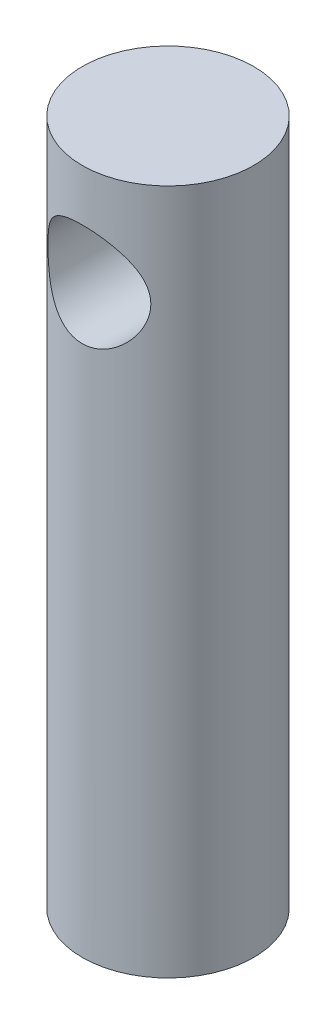
ISO-10303-21;
HEADER;
FILE_DESCRIPTION(('STEP AP214'),'2;1');
FILE_NAME('part.step','',(''),(''),'','','');
FILE_SCHEMA(('AUTOMOTIVE_DESIGN { 1 0 10303 214 1 1 1 1 }'));
ENDSEC;
DATA;
#1=APPLICATION_CONTEXT('core data for automotive mechanical design processes');
#2=APPLICATION_PROTOCOL_DEFINITION('international standard','automotive_design',2000,#1);
#3=PRODUCT_CONTEXT('',#1,'mechanical');
#4=PRODUCT('Part','Part','',(#3));
#5=PRODUCT_RELATED_PRODUCT_CATEGORY('part','',(#4));
#6=PRODUCT_DEFINITION_FORMATION('','',#4);
#7=PRODUCT_DEFINITION_CONTEXT('part definition',#1,'design');
#8=PRODUCT_DEFINITION('design','',#6,#7);
#9=PRODUCT_DEFINITION_SHAPE('','',#8);
#10=(LENGTH_UNIT() NAMED_UNIT(*) SI_UNIT(.MILLI.,.METRE.));
#11=(NAMED_UNIT(*) PLANE_ANGLE_UNIT() SI_UNIT($,.RADIAN.));
#12=(NAMED_UNIT(*) SI_UNIT($,.STERADIAN.) SOLID_ANGLE_UNIT());
#13=UNCERTAINTY_MEASURE_WITH_UNIT(LENGTH_MEASURE(1.E-05),#10,'distance_accuracy_value','');
#14=(GEOMETRIC_REPRESENTATION_CONTEXT(3) GLOBAL_UNCERTAINTY_ASSIGNED_CONTEXT((#13)) GLOBAL_UNIT_ASSIGNED_CONTEXT((#10,
#11,#12)) REPRESENTATION_CONTEXT('',''));
#15=CARTESIAN_POINT('',(0.,0.,0.));
#16=DIRECTION('',(0.,0.,1.));
#17=DIRECTION('',(1.,0.,0.));
#18=AXIS2_PLACEMENT_3D('',#15,#16,#17);
#19=CARTESIAN_POINT('',(0.,1000.,0.));
#20=DIRECTION('',(0.,-1.,0.));
#21=DIRECTION('',(0.,0.,-1.));
#22=AXIS2_PLACEMENT_3D('',#19,#20,#21);
#23=CYLINDRICAL_SURFACE('',#22,125.);
#24=CARTESIAN_POINT('',(0.,925.,-125.));
#25=CARTESIAN_POINT('',(-0.959722110232176,925.000001056757,-125.000000827529));
#26=CARTESIAN_POINT('',(-1.91941689168537,924.981574025456,-124.988941860156));
#27=CARTESIAN_POINT('',(-3.83698681383583,924.907931332241,-124.944776986206));
#28=CARTESIAN_POINT('',(-4.79486178004971,924.852712305218,-124.911669062963));
#29=CARTESIAN_POINT('',(-6.70724652643253,924.705642542479,-124.823593775022));
#30=CARTESIAN_POINT('',(-7.66175445802889,924.613774128865,-124.768615861332));
#31=CARTESIAN_POINT('',(-9.56518301751301,924.393717713739,-124.637143144398));
#32=CARTESIAN_POINT('',(-10.51410305079,924.265525915863,-124.560646092073));
#33=CARTESIAN_POINT('',(-12.4064101752449,923.972964623559,-124.386436793743));
#34=CARTESIAN_POINT('',(-13.3497817580004,923.808520831264,-124.288680983915));
#35=CARTESIAN_POINT('',(-15.2273706858531,923.444140802451,-124.07264120256));
#36=CARTESIAN_POINT('',(-16.1615870662034,923.244200867008,-123.954355091671));
#37=CARTESIAN_POINT('',(-18.0188947929254,922.809538078408,-123.698011462603));
#38=CARTESIAN_POINT('',(-18.9419888597735,922.574823925642,-123.559958890215));
#39=CARTESIAN_POINT('',(-20.7758408980345,922.071275224481,-123.264865629827));
#40=CARTESIAN_POINT('',(-21.6865976297387,921.802437274916,-123.10782304914));
#41=CARTESIAN_POINT('',(-23.4896684763035,921.232890546116,-122.77650952154));
#42=CARTESIAN_POINT('',(-24.3820528676786,920.932350952867,-122.602330334806));
#43=CARTESIAN_POINT('',(-26.1518501064884,920.299106769064,-122.237055079967));
#44=CARTESIAN_POINT('',(-27.0292615349032,919.966399149576,-122.045957418965));
#45=CARTESIAN_POINT('',(-29.6370751198179,918.921329849856,-121.448844647966));
#46=CARTESIAN_POINT('',(-31.3434666567524,918.161891798473,-121.018933691311));
#47=CARTESIAN_POINT('',(-34.682279623118,916.525155936155,-120.104687771239));
#48=CARTESIAN_POINT('',(-36.3147295642066,915.647904080245,-119.620374040424));
#49=CARTESIAN_POINT('',(-39.5000534724203,913.782071864688,-118.606657744607));
#50=CARTESIAN_POINT('',(-41.0529243797474,912.793487228984,-118.077253447963));
#51=CARTESIAN_POINT('',(-44.1891006504898,910.631862169676,-116.941495261235));
#52=CARTESIAN_POINT('',(-45.7656575951609,909.450498110865,-116.33235271735));
#53=CARTESIAN_POINT('',(-48.8146053883046,906.97361388502,-115.086259010443));
#54=CARTESIAN_POINT('',(-50.2869916971066,905.678088748458,-114.449306637445));
#55=CARTESIAN_POINT('',(-53.1243930618664,902.977723372946,-113.160195592913));
#56=CARTESIAN_POINT('',(-54.4892764852104,901.57275318291,-112.508019508819));
#57=CARTESIAN_POINT('',(-57.1050189315914,898.660540839028,-111.203207814469));
#58=CARTESIAN_POINT('',(-58.3558717567607,897.153293133883,-110.550572181176));
#59=CARTESIAN_POINT('',(-60.884960331711,893.850452511324,-109.18028929148));
#60=CARTESIAN_POINT('',(-62.1477056974845,892.042177034338,-108.464496962183));
#61=CARTESIAN_POINT('',(-64.5153510133502,888.309985756422,-107.073133314531));
#62=CARTESIAN_POINT('',(-65.6202248937295,886.386050930727,-106.397568649788));
#63=CARTESIAN_POINT('',(-67.6613662985516,882.432678107109,-105.111337664651));
#64=CARTESIAN_POINT('',(-68.5978539939264,880.403382415763,-104.500587032422));
#65=CARTESIAN_POINT('',(-69.8687682606836,877.28761644343,-103.651410338981));
#66=CARTESIAN_POINT('',(-70.2700981488528,876.237074667661,-103.379513444118));
#67=CARTESIAN_POINT('',(-71.026831025358,874.113474544449,-102.861068900778));
#68=CARTESIAN_POINT('',(-71.3822374634532,873.040417895365,-102.614519348499));
#69=CARTESIAN_POINT('',(-72.2170512864385,870.31377618622,-102.029778612642));
#70=CARTESIAN_POINT('',(-72.6656832954437,868.646630110673,-101.710033334953));
#71=CARTESIAN_POINT('',(-73.4487549476299,865.273436766861,-101.146001667322));
#72=CARTESIAN_POINT('',(-73.7832121999005,863.567395540702,-100.901703641758));
#73=CARTESIAN_POINT('',(-74.3333653266989,860.128162410531,-100.497103357787));
#74=CARTESIAN_POINT('',(-74.5491872203529,858.39500133554,-100.336711979238));
#75=CARTESIAN_POINT('',(-74.8594097061313,854.911807615275,-100.105477103977));
#76=CARTESIAN_POINT('',(-74.9538082082077,853.16177468011,-100.034635148671));
#77=CARTESIAN_POINT('',(-75.0197492036109,849.654621722351,-99.9851940624515));
#78=CARTESIAN_POINT('',(-74.9910494651801,847.897494530152,-100.006776804003));
#79=CARTESIAN_POINT('',(-74.810705731885,844.393151419052,-100.14175339264));
#80=CARTESIAN_POINT('',(-74.6590611396618,842.64593554835,-100.255147685815));
#81=CARTESIAN_POINT('',(-74.2350431123835,839.173148063241,-100.569516433027));
#82=CARTESIAN_POINT('',(-73.9625919652913,837.447591117435,-100.770547260196));
#83=CARTESIAN_POINT('',(-73.3007950239016,834.030577726416,-101.252953483703));
#84=CARTESIAN_POINT('',(-72.9114465285106,832.339122070131,-101.534330736563));
#85=CARTESIAN_POINT('',(-72.0265011658725,829.021625665303,-102.163954440672));
#86=CARTESIAN_POINT('',(-71.5323606557813,827.395018671879,-102.511278092645));
#87=CARTESIAN_POINT('',(-70.4399167495613,824.191424876146,-103.264989849925));
#88=CARTESIAN_POINT('',(-69.8416153032448,822.614437145656,-103.671376849589));
#89=CARTESIAN_POINT('',(-68.5456233925858,819.515258151688,-104.532782969627));
#90=CARTESIAN_POINT('',(-67.8479111769991,817.993078971965,-104.987812727663));
#91=CARTESIAN_POINT('',(-66.357759444552,815.008130194964,-105.935960169142));
#92=CARTESIAN_POINT('',(-65.5653123758729,813.545365346387,-106.429080887907));
#93=CARTESIAN_POINT('',(-63.7432483627895,810.432399496282,-107.531955984589));
#94=CARTESIAN_POINT('',(-62.6963902497333,808.794152817482,-108.147026586829));
#95=CARTESIAN_POINT('',(-60.4834207350213,805.609502833923,-109.400058352924));
#96=CARTESIAN_POINT('',(-59.3172989875114,804.063107515489,-110.038021499535));
#97=CARTESIAN_POINT('',(-56.8698999216281,801.065744010409,-111.322622724841));
#98=CARTESIAN_POINT('',(-55.5885237560561,799.614859620798,-111.969267837384));
#99=CARTESIAN_POINT('',(-52.9158697876858,796.814890878558,-113.25683318482));
#100=CARTESIAN_POINT('',(-51.524585822703,795.465812242161,-113.897753096473));
#101=CARTESIAN_POINT('',(-49.2582222607461,793.43278863153,-114.888792748737));
#102=CARTESIAN_POINT('',(-48.4184594405298,792.71230720348,-115.245436595954));
#103=CARTESIAN_POINT('',(-46.7057252580928,791.307567406611,-115.950128857788));
#104=CARTESIAN_POINT('',(-45.8327566363671,790.623306059626,-116.29817797784));
#105=CARTESIAN_POINT('',(-44.054361456332,789.292115408903,-116.983424385226));
#106=CARTESIAN_POINT('',(-43.1489277463485,788.645194413735,-117.320619250064));
#107=CARTESIAN_POINT('',(-41.306940214312,787.390268854825,-117.981752958626));
#108=CARTESIAN_POINT('',(-40.3703901010975,786.782259678191,-118.305693371982));
#109=CARTESIAN_POINT('',(-38.4674746199543,785.606647205666,-118.938044345757));
#110=CARTESIAN_POINT('',(-37.5011161447649,785.039034667575,-119.246458453626));
#111=CARTESIAN_POINT('',(-35.5398271220438,783.945620403982,-119.845617129645));
#112=CARTESIAN_POINT('',(-34.5448998412799,783.419813923777,-120.136363706277));
#113=CARTESIAN_POINT('',(-32.5279228529798,782.4114995065,-120.698094907616));
#114=CARTESIAN_POINT('',(-31.5058740766011,781.928990085402,-120.96908020959));
#115=CARTESIAN_POINT('',(-29.4363535735109,781.008816407253,-121.489256188738));
#116=CARTESIAN_POINT('',(-28.3888823204157,780.571151315552,-121.738447271537));
#117=CARTESIAN_POINT('',(-26.3371591990944,779.768312010638,-122.198153186774));
#118=CARTESIAN_POINT('',(-25.3343381336027,779.400308706496,-122.410115272246));
#119=CARTESIAN_POINT('',(-23.3098855693829,778.706282354478,-122.811701661605));
#120=CARTESIAN_POINT('',(-22.2882546226098,778.380258077012,-123.001326619745));
#121=CARTESIAN_POINT('',(-20.2281279051509,777.771359183524,-123.356862236975));
#122=CARTESIAN_POINT('',(-19.1896320520454,777.488484778448,-123.522772780133));
#123=CARTESIAN_POINT('',(-17.0979338882479,776.966977164884,-123.829632823954));
#124=CARTESIAN_POINT('',(-16.044731574276,776.728343966263,-123.97058231905));
#125=CARTESIAN_POINT('',(-13.9269985702488,776.296503734738,-124.226306044393));
#126=CARTESIAN_POINT('',(-12.8624801114943,776.103252017558,-124.341106019049));
#127=CARTESIAN_POINT('',(-10.7235594023813,775.762691330875,-124.543804612451));
#128=CARTESIAN_POINT('',(-9.64915707448271,775.615382722117,-124.631703019966));
#129=CARTESIAN_POINT('',(-7.49321782783113,775.367373367225,-124.779882482276));
#130=CARTESIAN_POINT('',(-6.41168175756668,775.266667176079,-124.840166763488));
#131=CARTESIAN_POINT('',(-4.24408130202927,775.112295821684,-124.932639429713));
#132=CARTESIAN_POINT('',(-3.15801708293274,775.058628947166,-124.964828836806));
#133=CARTESIAN_POINT('',(-1.13201067501296,775.002658579889,-124.998403395086));
#134=CARTESIAN_POINT('',(-0.192286881873205,774.994361514585,-125.003383014656));
#135=CARTESIAN_POINT('',(1.68677156880062,775.013083618454,-124.992149976467));
#136=CARTESIAN_POINT('',(2.62610618702842,775.040105753486,-124.975935538978));
#137=CARTESIAN_POINT('',(4.50230163962597,775.129370647731,-124.922415399725));
#138=CARTESIAN_POINT('',(5.43916293922211,775.191606226445,-124.885113997881));
#139=CARTESIAN_POINT('',(7.30892565842403,775.351088040059,-124.789646915423));
#140=CARTESIAN_POINT('',(8.24182667398913,775.448337764298,-124.731479155372));
#141=CARTESIAN_POINT('',(10.1017151523698,775.677505735627,-124.594641566255));
#142=CARTESIAN_POINT('',(11.0287034075919,775.80941923278,-124.515974546192));
#143=CARTESIAN_POINT('',(12.8753120491395,776.10750258115,-124.338597533696));
#144=CARTESIAN_POINT('',(13.7949316835551,776.273675883206,-124.239885522234));
#145=CARTESIAN_POINT('',(15.6250520127251,776.639735471408,-124.023008522261));
#146=CARTESIAN_POINT('',(16.5355534493232,776.83961899094,-123.904845130151));
#147=CARTESIAN_POINT('',(18.3460218791383,777.272493565739,-123.6497462284));
#148=CARTESIAN_POINT('',(19.2459878807409,777.505487710748,-123.512808966903));
#149=CARTESIAN_POINT('',(21.8840183505763,778.240918316345,-123.082125217543));
#150=CARTESIAN_POINT('',(23.6055344969327,778.78894390347,-122.763057811301));
#151=CARTESIAN_POINT('',(26.9931120805186,780.002780969192,-122.062955848234));
#152=CARTESIAN_POINT('',(28.6591752053481,780.668588859423,-121.681923179275));
#153=CARTESIAN_POINT('',(31.9283951093063,782.112074590156,-120.865281140487));
#154=CARTESIAN_POINT('',(33.531546471849,782.889762036502,-120.42966708478));
#155=CARTESIAN_POINT('',(36.668220061423,784.55084456278,-119.511977443166));
#156=CARTESIAN_POINT('',(38.2017379532471,785.434246211802,-119.029898970318));
#157=CARTESIAN_POINT('',(41.3490243395466,787.397716694428,-117.975803321683));
#158=CARTESIAN_POINT('',(42.9546132286456,788.488680686134,-117.399644074125));
#159=CARTESIAN_POINT('',(46.0684603278338,790.784800376854,-116.213053300481));
#160=CARTESIAN_POINT('',(47.5767128815785,791.98996270206,-115.602619786519));
#161=CARTESIAN_POINT('',(50.4924328227858,794.509188556576,-114.359208923005));
#162=CARTESIAN_POINT('',(51.8997913678158,795.823366489673,-113.726208298408));
#163=CARTESIAN_POINT('',(54.6074506452903,798.553684305109,-112.4511720888));
#164=CARTESIAN_POINT('',(55.9077460902192,799.969829216814,-111.80913605939));
#165=CARTESIAN_POINT('',(58.5592120487927,803.090094776814,-110.446007061375));
#166=CARTESIAN_POINT('',(59.8948967590172,804.807684429514,-109.725525258644));
#167=CARTESIAN_POINT('',(62.4167971064168,808.360008541963,-108.310823876526));
#168=CARTESIAN_POINT('',(63.6029886862773,810.19476178497,-107.616608536639));
#169=CARTESIAN_POINT('',(65.8165687985047,813.972671702881,-106.277239297247));
#170=CARTESIAN_POINT('',(66.844087746857,815.915737546391,-105.632045330148));
#171=CARTESIAN_POINT('',(68.7316108138498,819.90303496788,-104.413735297036));
#172=CARTESIAN_POINT('',(69.5916658315065,821.947235569304,-103.840597349129));
#173=CARTESIAN_POINT('',(70.9669282315919,825.674214395668,-102.903984433554));
#174=CARTESIAN_POINT('',(71.516497341583,827.339712348054,-102.521960644653));
#175=CARTESIAN_POINT('',(72.5005409134891,830.71874866518,-101.828455778032));
#176=CARTESIAN_POINT('',(72.9350308151248,832.432280551251,-101.516965237962));
#177=CARTESIAN_POINT('',(73.6832110560725,835.896105095789,-100.975234980827));
#178=CARTESIAN_POINT('',(73.9970439121234,837.646351793585,-100.744899432801));
#179=CARTESIAN_POINT('',(74.5001921887106,841.174156465221,-100.373401254296));
#180=CARTESIAN_POINT('',(74.689506882237,842.951714598459,-100.232239144463));
#181=CARTESIAN_POINT('',(74.9410941269177,846.527672967696,-100.044277813329));
#182=CARTESIAN_POINT('',(75.0028795156397,848.326126830675,-99.9978404488127));
#183=CARTESIAN_POINT('',(74.9969141079794,851.922696142193,-100.002314333306));
#184=CARTESIAN_POINT('',(74.9291630839338,853.720811590133,-100.053225753409));
#185=CARTESIAN_POINT('',(74.6651986421464,857.303114238546,-100.25036118264));
#186=CARTESIAN_POINT('',(74.4689241300454,859.087294406439,-100.396630520541));
#187=CARTESIAN_POINT('',(73.9509838188765,862.627468416299,-100.77874303513));
#188=CARTESIAN_POINT('',(73.6293175020419,864.383462141845,-101.014586581686));
#189=CARTESIAN_POINT('',(72.8836135105945,867.771917404358,-101.553825664236));
#190=CARTESIAN_POINT('',(72.4652798518774,869.406245866085,-101.853402104021));
#191=CARTESIAN_POINT('',(71.7593299386909,871.824395916468,-102.350774281899));
#192=CARTESIAN_POINT('',(71.5109302682659,872.624910977927,-102.524571850917));
#193=CARTESIAN_POINT('',(70.9885088237164,874.214280501626,-102.886990283486));
#194=CARTESIAN_POINT('',(70.7144832695028,875.003133223609,-103.075613333295));
#195=CARTESIAN_POINT('',(69.854861479861,877.350982842934,-103.661852491916));
#196=CARTESIAN_POINT('',(69.2317028311689,878.891330225605,-104.079850908929));
#197=CARTESIAN_POINT('',(67.8899829322411,881.916919984408,-104.95996179042));
#198=CARTESIAN_POINT('',(67.1714094993927,883.402155292763,-105.422079886003));
#199=CARTESIAN_POINT('',(65.9666208591409,885.697399987175,-106.1775665863));
#200=CARTESIAN_POINT('',(65.5107240607951,886.52722825365,-106.45961077841));
#201=CARTESIAN_POINT('',(64.5694770852888,888.166421207447,-107.033108698817));
#202=CARTESIAN_POINT('',(64.0841328191744,888.975789955742,-107.32456053324));
#203=CARTESIAN_POINT('',(62.5847037544419,891.372787540599,-108.210453157144));
#204=CARTESIAN_POINT('',(61.5272208862301,892.929311146389,-108.816432209348));
#205=CARTESIAN_POINT('',(59.301259957115,895.95532318331,-110.045346588003));
#206=CARTESIAN_POINT('',(58.132703493946,897.424748929875,-110.668293666861));
#207=CARTESIAN_POINT('',(55.6895229411553,900.271211935068,-111.917646521187));
#208=CARTESIAN_POINT('',(54.414892110051,901.648243311575,-112.544052514119));
#209=CARTESIAN_POINT('',(51.5469955162066,904.522245131933,-113.889459947338));
#210=CARTESIAN_POINT('',(49.9357029244182,906.002027149487,-114.606859810657));
#211=CARTESIAN_POINT('',(46.5814368661932,908.821497122548,-116.010662780973));
#212=CARTESIAN_POINT('',(44.8384474398094,910.161168051356,-116.697062114951));
#213=CARTESIAN_POINT('',(42.1312467559261,912.057826871904,-117.689779442055));
#214=CARTESIAN_POINT('',(41.2130091078271,912.671460701862,-118.014660453567));
#215=CARTESIAN_POINT('',(39.3467658315937,913.859652712167,-118.649917930763));
#216=CARTESIAN_POINT('',(38.3987635769574,914.434215297618,-118.960296030347));
#217=CARTESIAN_POINT('',(36.4742002441529,915.542856867671,-119.564418179021));
#218=CARTESIAN_POINT('',(35.4976386976757,916.076935187904,-119.858161955115));
#219=CARTESIAN_POINT('',(33.5174921118791,917.103062256835,-120.426901499487));
#220=CARTESIAN_POINT('',(32.5139105562843,917.595116389959,-120.701899668666));
#221=CARTESIAN_POINT('',(30.5121065162629,918.52145985692,-121.223134564924));
#222=CARTESIAN_POINT('',(29.5146475946872,918.957050007605,-121.469991282912));
#223=CARTESIAN_POINT('',(27.497499491762,919.785932101836,-121.94244694616));
#224=CARTESIAN_POINT('',(26.4778130520264,920.179229226833,-122.168048495036));
#225=CARTESIAN_POINT('',(24.4176771791565,920.922326661825,-122.596428245745));
#226=CARTESIAN_POINT('',(23.377222470256,921.272115751991,-122.799200559112));
#227=CARTESIAN_POINT('',(21.2778708682989,921.926776139414,-123.180316146907));
#228=CARTESIAN_POINT('',(20.2189742462824,922.231648096194,-123.358659780021));
#229=CARTESIAN_POINT('',(18.0884896644123,922.794343443069,-123.688983846501));
#230=CARTESIAN_POINT('',(17.0169548440774,923.052318147469,-123.841048986229));
#231=CARTESIAN_POINT('',(14.8602391369951,923.521364701453,-124.118311603157));
#232=CARTESIAN_POINT('',(13.775058566974,923.732437637541,-124.243509702744));
#233=CARTESIAN_POINT('',(11.5944171933402,924.106629256784,-124.465938650613));
#234=CARTESIAN_POINT('',(10.4989641369105,924.269781482356,-124.563189060031));
#235=CARTESIAN_POINT('',(8.29993864770838,924.547560431281,-124.729011488361));
#236=CARTESIAN_POINT('',(7.19636801166442,924.662197582473,-124.79758967005));
#237=CARTESIAN_POINT('',(5.5841318357061,924.79355186047,-124.876236241724));
#238=CARTESIAN_POINT('',(5.07752302863693,924.829651950288,-124.897863073969));
#239=CARTESIAN_POINT('',(4.06356774322271,924.891557166917,-124.934961950125));
#240=CARTESIAN_POINT('',(3.55622146186317,924.917364665179,-124.950435411794));
#241=CARTESIAN_POINT('',(2.03318452317516,924.979321606339,-124.987589252958));
#242=CARTESIAN_POINT('',(1.01657693026111,924.999998880639,-124.999999123447));
#243=CARTESIAN_POINT('',(0.,925.,-125.));
#244=B_SPLINE_CURVE_WITH_KNOTS('',3,(#24,#25,#26,#27,#28,#29,#30,#31,#32,#33,#34,#35,#36,#37,
#38,#39,#40,#41,#42,#43,#44,#45,#46,#47,#48,#49,#50,#51,#52,#53,#54,#55,#56,#57,#58,#59,#60,#61,
#62,#63,#64,#65,#66,#67,#68,#69,#70,#71,#72,#73,#74,#75,#76,#77,#78,#79,#80,#81,#82,#83,#84,#85,
#86,#87,#88,#89,#90,#91,#92,#93,#94,#95,#96,#97,#98,#99,#100,#101,#102,#103,#104,#105,#106,#107,
#108,#109,#110,#111,#112,#113,#114,#115,#116,#117,#118,#119,#120,#121,#122,#123,#124,#125,#126,
#127,#128,#129,#130,#131,#132,#133,#134,#135,#136,#137,#138,#139,#140,#141,#142,#143,#144,#145,
#146,#147,#148,#149,#150,#151,#152,#153,#154,#155,#156,#157,#158,#159,#160,#161,#162,#163,#164,
#165,#166,#167,#168,#169,#170,#171,#172,#173,#174,#175,#176,#177,#178,#179,#180,#181,#182,#183,
#184,#185,#186,#187,#188,#189,#190,#191,#192,#193,#194,#195,#196,#197,#198,#199,#200,#201,#202,
#203,#204,#205,#206,#207,#208,#209,#210,#211,#212,#213,#214,#215,#216,#217,#218,#219,#220,#221,
#222,#223,#224,#225,#226,#227,#228,#229,#230,#231,#232,#233,#234,#235,#236,#237,#238,#239,#240,
#241,#242,#243),.UNSPECIFIED.,.T.,.F.,(4,2,2,2,2,2,2,2,2,2,2,2,2,2,2,2,2,2,2,2,2,2,2,2,2,2,2,2,
2,2,2,2,2,2,2,2,2,2,2,2,2,2,2,2,2,2,2,2,2,2,2,2,2,2,2,2,2,2,2,2,2,2,2,2,2,2,2,2,2,2,2,2,2,2,2,2,
2,2,2,2,2,2,2,2,2,2,2,2,2,2,2,2,2,2,2,2,2,2,2,2,2,2,2,2,2,2,2,2,2,4),(0.,2.8788789130324,
5.75802117342907,8.63855387569456,11.519387749958,14.406181663071,17.2932765754072,
20.1796503623808,23.0663120647531,25.9382807940423,28.8105202111019,34.5536924032782,
40.2946308573531,46.0357898840059,52.2158388766049,58.3961570249827,64.5839287145585,
70.7720365257766,77.7198304689992,84.6687703961368,91.6085571958027,95.0783401752883,
98.5478623537401,103.809525294735,109.070376366275,114.325628303189,119.58097069699,
124.846659252032,130.112373391913,135.381479768101,140.650707904497,145.851013802852,
151.051222365967,156.252570495792,161.454333529548,167.565739141416,173.677675354473,
179.794904342992,185.912476549049,189.39916676629,192.885569846565,196.372745716385,
199.859507422066,203.34546882257,206.831033187575,210.31647803775,213.801858004469,
217.067807905987,220.333662124092,223.599532307399,226.865403219105,230.128044823083,
233.390712044727,236.652997961058,239.915165191937,242.73360890108,245.552289298585,
248.370395135802,251.188781889347,254.006782643728,256.825067381719,259.643120934226,
262.461437628316,267.958843338945,273.456081593953,278.953792117169,284.451844446232,
290.520290196986,296.589088276288,302.664337693498,308.739886968749,315.607887671176,
322.476992205236,329.34042049492,336.201759445526,341.581400656012,346.960319735359,
352.332865721693,357.705443075818,363.098505996434,368.491578395496,373.887216284562,
379.282876453483,384.417559675746,386.985046407484,389.552912469891,394.688456872746,
399.824657616407,402.787803600728,405.750356742433,411.675450938191,417.604758918358,
423.534444019781,430.433404939177,437.333203268209,440.785857028453,444.238120870196,
447.690441353186,451.14231883568,454.489320742556,457.835912129543,461.183364752331,
464.530768219172,467.867171771921,471.203498027092,474.537483402977,477.870751807001,
479.39569437252,480.920285382216,483.969711728449),.UNSPECIFIED.);
#245=CARTESIAN_POINT('',(0.,925.,-125.));
#246=VERTEX_POINT('',#245);
#247=EDGE_CURVE('E10',#246,#246,#244,.T.);
#248=ORIENTED_EDGE('',*,*,#247,.T.);
#249=EDGE_LOOP('',(#248));
#250=FACE_BOUND('',#249,.T.);
#251=CARTESIAN_POINT('',(75.,850.,100.));
#252=CARTESIAN_POINT('',(75.0000007368017,849.056622436247,99.9999989096946));
#253=CARTESIAN_POINT('',(74.9821944502504,848.113261800126,100.013361451452));
#254=CARTESIAN_POINT('',(74.9110489948005,846.228507952947,100.066661463235));
#255=CARTESIAN_POINT('',(74.8577053230991,845.287115006372,100.10660230089));
#256=CARTESIAN_POINT('',(74.7157283808434,843.408552637684,100.212612778481));
#257=CARTESIAN_POINT('',(74.6270978318469,842.471382895486,100.278680403343));
#258=CARTESIAN_POINT('',(74.4149526257966,840.603275294315,100.436209914724));
#259=CARTESIAN_POINT('',(74.2914423630851,839.672336665426,100.52766860231));
#260=CARTESIAN_POINT('',(74.0099155040827,837.81750439182,100.735112991167));
#261=CARTESIAN_POINT('',(73.851865019668,836.893618594613,100.851122776468));
#262=CARTESIAN_POINT('',(73.5019691426969,835.055578250258,101.106416220375));
#263=CARTESIAN_POINT('',(73.3101254303426,834.141423221692,101.245698721843));
#264=CARTESIAN_POINT('',(72.8933513195573,832.324364602375,101.546173370666));
#265=CARTESIAN_POINT('',(72.6684222246621,831.421460569864,101.707364654815));
#266=CARTESIAN_POINT('',(72.1862152766579,829.62813513841,102.050172615162));
#267=CARTESIAN_POINT('',(71.9289313146195,828.73771613215,102.231793147925));
#268=CARTESIAN_POINT('',(71.1138978818921,826.100608100762,102.802002716895));
#269=CARTESIAN_POINT('',(70.5097189620692,824.373989790534,103.218311829976));
#270=CARTESIAN_POINT('',(69.183325736937,820.983048511816,104.111988085));
#271=CARTESIAN_POINT('',(68.4610958929297,819.318733779656,104.589363263092));
#272=CARTESIAN_POINT('',(67.2938062264138,816.873577185898,105.341150303364));
#273=CARTESIAN_POINT('',(66.8906369933416,816.066933963571,105.59775050106));
#274=CARTESIAN_POINT('',(66.057070272541,814.471514565021,106.121183779168));
#275=CARTESIAN_POINT('',(65.6266798869076,813.682733800759,106.388014183388));
#276=CARTESIAN_POINT('',(64.2953702223403,811.343498631653,107.20161803512));
#277=CARTESIAN_POINT('',(63.3543353068856,809.820199166124,107.761489252337));
#278=CARTESIAN_POINT('',(61.2489405154287,806.668894183979,108.973471527398));
#279=CARTESIAN_POINT('',(60.0713433089816,805.05086677085,109.628489491473));
#280=CARTESIAN_POINT('',(57.5933476279836,801.916770544493,110.950341103677));
#281=CARTESIAN_POINT('',(56.2929420845364,800.400707608992,111.617175430163));
#282=CARTESIAN_POINT('',(53.573630679719,797.47517089369,112.947595161094));
#283=CARTESIAN_POINT('',(52.1546415212918,796.065773386196,113.611177929221));
#284=CARTESIAN_POINT('',(49.203656371982,793.360742233223,114.919991603721));
#285=CARTESIAN_POINT('',(47.6716546222543,792.065114392546,115.565221572555));
#286=CARTESIAN_POINT('',(45.2075474292111,790.14585563384,116.542577049883));
#287=CARTESIAN_POINT('',(44.3124168898355,789.480102092111,116.886072805105));
#288=CARTESIAN_POINT('',(42.4902536331552,788.187169702674,117.560715166395));
#289=CARTESIAN_POINT('',(41.5632239276132,787.559987228775,117.891862932182));
#290=CARTESIAN_POINT('',(39.6781739471354,786.345463834905,118.539597054535));
#291=CARTESIAN_POINT('',(38.7201468661564,785.758131753705,118.856180175701));
#292=CARTESIAN_POINT('',(36.7746904552977,784.625011557659,119.47243652368));
#293=CARTESIAN_POINT('',(35.7872648655137,784.079218189388,119.772111887584));
#294=CARTESIAN_POINT('',(33.7849115396492,783.03093166902,120.352256452236));
#295=CARTESIAN_POINT('',(32.7699992898733,782.528414775165,120.632736166278));
#296=CARTESIAN_POINT('',(30.7139289996957,781.567976556946,121.172538484533));
#297=CARTESIAN_POINT('',(29.6727742195617,781.110049726931,121.431863700103));
#298=CARTESIAN_POINT('',(27.5660409055945,780.240326966324,121.927372909342));
#299=CARTESIAN_POINT('',(26.5004639190105,779.828528123008,122.163558364037));
#300=CARTESIAN_POINT('',(24.3469461253674,779.052582667273,122.61091108036));
#301=CARTESIAN_POINT('',(23.2590059689748,778.688434670695,122.822079068676));
#302=CARTESIAN_POINT('',(21.1679017020807,778.041673560448,123.198776114242));
#303=CARTESIAN_POINT('',(20.1665542059339,777.754595920195,123.366737370705));
#304=CARTESIAN_POINT('',(18.1494043863423,777.22165665491,123.679588886459));
#305=CARTESIAN_POINT('',(17.1336025114624,776.975793753868,123.824479859999));
#306=CARTESIAN_POINT('',(15.0896195821245,776.526206403429,124.090150522953));
#307=CARTESIAN_POINT('',(14.0614388896689,776.322480724936,124.210930915642));
#308=CARTESIAN_POINT('',(11.994873036665,775.957958590646,124.427498553331));
#309=CARTESIAN_POINT('',(10.9564878471025,775.797162256947,124.523285727247));
#310=CARTESIAN_POINT('',(8.87266454162926,775.519265293953,124.689082979093));
#311=CARTESIAN_POINT('',(7.82723255177974,775.40213071478,124.75911308427));
#312=CARTESIAN_POINT('',(5.73093838320815,775.211872615861,124.872968189147));
#313=CARTESIAN_POINT('',(4.68007617131964,775.138749365246,124.9167930286));
#314=CARTESIAN_POINT('',(2.57552546239928,775.03683258169,124.97789728102));
#315=CARTESIAN_POINT('',(1.52183721582213,775.008035242505,124.995178973232));
#316=CARTESIAN_POINT('',(-0.585896938185308,774.994884733246,125.003069052233));
#317=CARTESIAN_POINT('',(-1.6399428338143,775.01053021688,124.993678247005));
#318=CARTESIAN_POINT('',(-3.6149908457345,775.08148873943,124.951121161703));
#319=CARTESIAN_POINT('',(-4.53625101589787,775.13163147792,124.921054002615));
#320=CARTESIAN_POINT('',(-6.37550207869955,775.265782834526,124.840699763649));
#321=CARTESIAN_POINT('',(-7.2934926924394,775.349794275054,124.790410998625));
#322=CARTESIAN_POINT('',(-9.12427582641631,775.551389911784,124.669920270467));
#323=CARTESIAN_POINT('',(-10.0370693418573,775.66896744359,124.599722260241));
#324=CARTESIAN_POINT('',(-11.8561256343953,775.937339921782,124.439808765941));
#325=CARTESIAN_POINT('',(-12.7623877759925,776.088138056633,124.350091408439));
#326=CARTESIAN_POINT('',(-14.5666888545188,776.422467168974,124.151662249955));
#327=CARTESIAN_POINT('',(-15.4647283468744,776.605995918158,124.042951742041));
#328=CARTESIAN_POINT('',(-17.2512604387961,777.005261079551,123.807132134872));
#329=CARTESIAN_POINT('',(-18.1397521306258,777.221000525584,123.680021302584));
#330=CARTESIAN_POINT('',(-19.9056811482895,777.684047781953,123.408110760951));
#331=CARTESIAN_POINT('',(-20.7831191655372,777.931353606913,123.263312164109));
#332=CARTESIAN_POINT('',(-22.5257279587952,778.456864979362,122.956800257369));
#333=CARTESIAN_POINT('',(-23.3908975995503,778.735073365651,122.795085393573));
#334=CARTESIAN_POINT('',(-25.9757748736177,779.618284608203,122.283905559516));
#335=CARTESIAN_POINT('',(-27.6752068589994,780.269338934913,121.909902685916));
#336=CARTESIAN_POINT('',(-31.0105427240236,781.687251965444,121.104464782032));
#337=CARTESIAN_POINT('',(-32.6464472001925,782.454109581535,120.673030291204));
#338=CARTESIAN_POINT('',(-35.8482001535299,784.097461113872,119.760917569423));
#339=CARTESIAN_POINT('',(-37.4140388862841,784.973970215984,119.280232519328));
#340=CARTESIAN_POINT('',(-40.4696266298914,786.830340910105,118.278464744869));
#341=CARTESIAN_POINT('',(-41.9593708619461,787.810208981328,117.7573794885));
#342=CARTESIAN_POINT('',(-45.0312196918019,789.990436661503,116.61981888469));
#343=CARTESIAN_POINT('',(-46.6030987599184,791.203152834872,115.999384397656));
#344=CARTESIAN_POINT('',(-49.6399437226057,793.743482269464,114.7326610009));
#345=CARTESIAN_POINT('',(-51.1049022386933,795.071103446376,114.086370311622));
#346=CARTESIAN_POINT('',(-53.9247181500307,797.836511915778,112.780945193724));
#347=CARTESIAN_POINT('',(-55.2794325890902,799.274437695493,112.121795420709));
#348=CARTESIAN_POINT('',(-57.8718552526224,802.253301947711,110.805964312831));
#349=CARTESIAN_POINT('',(-59.1095580719558,803.794245173308,110.149283093341));
#350=CARTESIAN_POINT('',(-61.5993651487917,807.158527613715,108.778513398027));
#351=CARTESIAN_POINT('',(-62.836472383623,808.993886232195,108.066606529788));
#352=CARTESIAN_POINT('',(-65.1505149253369,812.779960346861,106.687511195764));
#353=CARTESIAN_POINT('',(-66.2274238944586,814.730694738145,106.020330093104));
#354=CARTESIAN_POINT('',(-67.7140212276913,817.734570228739,105.072149658735));
#355=CARTESIAN_POINT('',(-68.1878522504091,818.74820668269,104.765019580684));
#356=CARTESIAN_POINT('',(-69.0916432504824,820.800655072341,104.17119105562));
#357=CARTESIAN_POINT('',(-69.5216089197493,821.839463720026,103.884489959227));
#358=CARTESIAN_POINT('',(-70.3361577619508,823.940566721267,103.334729949219));
#359=CARTESIAN_POINT('',(-70.7207523284379,825.002855098714,103.071665104061));
#360=CARTESIAN_POINT('',(-71.4431667256051,827.149259690332,102.572250729162));
#361=CARTESIAN_POINT('',(-71.7809902568666,828.233374169812,102.335899086112));
#362=CARTESIAN_POINT('',(-72.5666436310995,830.973378664995,101.781221162294));
#363=CARTESIAN_POINT('',(-72.9840649006616,832.641972582169,101.481643317991));
#364=CARTESIAN_POINT('',(-73.7048127453447,836.015194505286,100.959392973826));
#365=CARTESIAN_POINT('',(-74.0081575384667,837.719816711551,100.736708194615));
#366=CARTESIAN_POINT('',(-74.4965570122907,841.153192010726,100.376070502652));
#367=CARTESIAN_POINT('',(-74.6817288799713,842.881919455211,100.23803365354));
#368=CARTESIAN_POINT('',(-74.931479977011,846.35296394009,100.051476145472));
#369=CARTESIAN_POINT('',(-74.9960566488777,848.095281267901,100.002957384949));
#370=CARTESIAN_POINT('',(-75.0035977828384,851.582731210844,99.9973017909596));
#371=CARTESIAN_POINT('',(-74.9463948329077,853.32786440174,100.040290754337));
#372=CARTESIAN_POINT('',(-74.7109423547353,856.805319989601,100.216248282125));
#373=CARTESIAN_POINT('',(-74.5326921960041,858.537642319792,100.349217315208));
#374=CARTESIAN_POINT('',(-74.0576711774189,861.978300612968,100.700288806991));
#375=CARTESIAN_POINT('',(-73.7608206981006,863.686619662801,100.918448454126));
#376=CARTESIAN_POINT('',(-73.0526366944044,867.067383791924,101.432258806092));
#377=CARTESIAN_POINT('',(-72.641299953927,868.739827862008,101.727911687816));
#378=CARTESIAN_POINT('',(-71.7096464698695,872.037669254454,102.386772420387));
#379=CARTESIAN_POINT('',(-71.1894828321233,873.663129059483,102.749885283929));
#380=CARTESIAN_POINT('',(-70.0449324933487,876.862507281529,103.533511836864));
#381=CARTESIAN_POINT('',(-69.4205469605847,878.436426276051,103.954024882825));
#382=CARTESIAN_POINT('',(-68.0723408962971,881.527777954595,104.841822270952));
#383=CARTESIAN_POINT('',(-67.3484976360883,883.045197626014,105.309117297378));
#384=CARTESIAN_POINT('',(-65.8060243309963,886.019071571523,106.279807932011));
#385=CARTESIAN_POINT('',(-64.9873867510209,887.475520986612,106.783206408829));
#386=CARTESIAN_POINT('',(-63.1035222571498,890.580928325235,107.909019381785));
#387=CARTESIAN_POINT('',(-62.0204491844885,892.217238513035,108.53652594547));
#388=CARTESIAN_POINT('',(-59.7337309503752,895.395087216687,109.811635530006));
#389=CARTESIAN_POINT('',(-58.5300748773446,896.93661713545,110.459240365886));
#390=CARTESIAN_POINT('',(-56.0062749922354,899.921137132458,111.760075987326));
#391=CARTESIAN_POINT('',(-54.6860300731831,901.364039718048,112.413311203765));
#392=CARTESIAN_POINT('',(-51.9344286520984,904.144622396148,113.710720648592));
#393=CARTESIAN_POINT('',(-50.5030664018737,905.482297037912,114.354894406186));
#394=CARTESIAN_POINT('',(-48.1799402529957,907.488453914288,115.345246785679));
#395=CARTESIAN_POINT('',(-47.3241010495898,908.195053186404,115.699233711128));
#396=CARTESIAN_POINT('',(-45.5794840854555,909.571342143912,116.397564778456));
#397=CARTESIAN_POINT('',(-44.690709153379,910.241034986744,116.741909743986));
#398=CARTESIAN_POINT('',(-42.8810093581866,911.54235516571,117.418706323325));
#399=CARTESIAN_POINT('',(-41.9600773853749,912.173973998708,117.751155273688));
#400=CARTESIAN_POINT('',(-40.0874665931438,913.397521680541,118.401762402805));
#401=CARTESIAN_POINT('',(-39.1357915101054,913.989455325845,118.719922307036));
#402=CARTESIAN_POINT('',(-37.2031765310072,915.132045434379,119.339654182854));
#403=CARTESIAN_POINT('',(-36.2222466823979,915.682715846206,119.641231750663));
#404=CARTESIAN_POINT('',(-34.2323499687747,916.741412660446,120.225710137427));
#405=CARTESIAN_POINT('',(-33.2233863917869,917.249444036049,120.50861313366));
#406=CARTESIAN_POINT('',(-31.1789731520618,918.221350178825,121.053668866692));
#407=CARTESIAN_POINT('',(-30.1435246294981,918.685226842809,121.315822494767));
#408=CARTESIAN_POINT('',(-28.0479403792509,919.567271869291,121.817378446897));
#409=CARTESIAN_POINT('',(-26.9878051865143,919.985441221127,122.05678126338));
#410=CARTESIAN_POINT('',(-24.9227129475947,920.745880713107,122.494449402334));
#411=CARTESIAN_POINT('',(-23.9193380075446,921.09145711513,122.694439492831));
#412=CARTESIAN_POINT('',(-21.8949700765908,921.740784254863,123.071809562603));
#413=CARTESIAN_POINT('',(-20.8739776141378,922.044536244683,123.249190218731));
#414=CARTESIAN_POINT('',(-18.8163639822288,922.609107967863,123.580055990007));
#415=CARTESIAN_POINT('',(-17.7797428868852,922.86992790474,123.733541218432));
#416=CARTESIAN_POINT('',(-15.693043676261,923.347624255382,124.015469999975));
#417=CARTESIAN_POINT('',(-14.6429655481229,923.564500627157,124.143913529165));
#418=CARTESIAN_POINT('',(-12.5326824021517,923.953241219417,124.374665574089));
#419=CARTESIAN_POINT('',(-11.4724877710692,924.125147337049,124.476998413994));
#420=CARTESIAN_POINT('',(-9.34347116498629,924.423483937602,124.654886043962));
#421=CARTESIAN_POINT('',(-8.27464912608578,924.549914083381,124.730440635501));
#422=CARTESIAN_POINT('',(-6.13109793781268,924.756731621178,124.854163159596));
#423=CARTESIAN_POINT('',(-5.05636944333794,924.837124017794,124.90233406893));
#424=CARTESIAN_POINT('',(-2.90358346869333,924.951524249171,124.970912097293));
#425=CARTESIAN_POINT('',(-1.82552610597986,924.985533702189,124.99132018494));
#426=CARTESIAN_POINT('',(0.18713683127922,925.005587337868,125.003352500427));
#427=CARTESIAN_POINT('',(1.12167028868138,924.997431322332,124.998457193689));
#428=CARTESIAN_POINT('',(2.98952387719068,924.946218368239,124.967736685656));
#429=CARTESIAN_POINT('',(3.92284390016987,924.903158507881,124.941909732175));
#430=CARTESIAN_POINT('',(5.78622748070958,924.782291462879,124.869486991327));
#431=CARTESIAN_POINT('',(6.71629166121032,924.704491337812,124.822895423546));
#432=CARTESIAN_POINT('',(8.57172040584143,924.514397168458,124.709220118816));
#433=CARTESIAN_POINT('',(9.49708449724522,924.402099721692,124.642134360522));
#434=CARTESIAN_POINT('',(11.3412371550565,924.143396174587,124.487880594775));
#435=CARTESIAN_POINT('',(12.2600264529893,923.996993931605,124.400714858441));
#436=CARTESIAN_POINT('',(14.0896077327441,923.670527136146,124.206800672158));
#437=CARTESIAN_POINT('',(15.0003989145093,923.490459255341,124.100050286007));
#438=CARTESIAN_POINT('',(16.8123031058724,923.097234601224,123.867592744685));
#439=CARTESIAN_POINT('',(17.7134168473264,922.884080349178,123.741887033978));
#440=CARTESIAN_POINT('',(19.5046088825055,922.425308751601,123.472227775158));
#441=CARTESIAN_POINT('',(20.394686142123,922.179688388794,123.328272531054));
#442=CARTESIAN_POINT('',(23.0175862688089,921.403625233567,122.875149160679));
#443=CARTESIAN_POINT('',(24.7328451003342,920.827478825355,122.540856598365));
#444=CARTESIAN_POINT('',(28.1056917542917,919.55802264466,121.81153038194));
#445=CARTESIAN_POINT('',(29.7632809994172,918.864715764969,121.416498227564));
#446=CARTESIAN_POINT('',(33.0136181998449,917.366928603679,120.5732968618));
#447=CARTESIAN_POINT('',(34.6063590232017,916.562436136561,120.12512182692));
#448=CARTESIAN_POINT('',(37.7204664504609,914.848485468136,119.18394677894));
#449=CARTESIAN_POINT('',(39.2418285562052,913.939020664125,118.69094394661));
#450=CARTESIAN_POINT('',(42.3690458936634,911.916856845163,117.613296534797));
#451=CARTESIAN_POINT('',(43.9661452765051,910.792813045095,117.024513422465));
#452=CARTESIAN_POINT('',(47.0604147931046,908.430361556106,115.814841846305));
#453=CARTESIAN_POINT('',(48.5575790276152,907.191947126067,115.193951490996));
#454=CARTESIAN_POINT('',(51.4484663732722,904.606044300359,113.932194737529));
#455=CARTESIAN_POINT('',(52.8420837388459,903.258447260783,113.291308842175));
#456=CARTESIAN_POINT('',(55.5196576599163,900.461044644536,112.003460296185));
#457=CARTESIAN_POINT('',(56.8036078394188,899.011233134101,111.356497294652));
#458=CARTESIAN_POINT('',(59.4130530791256,895.824140396228,109.988749944545));
#459=CARTESIAN_POINT('',(60.7231270969944,894.073731236292,109.26902146538));
#460=CARTESIAN_POINT('',(63.1907778379752,890.456406372219,107.860764985316));
#461=CARTESIAN_POINT('',(64.3483360540664,888.589476569323,107.172240777535));
#462=CARTESIAN_POINT('',(66.5020505086898,884.746574174835,105.849298829278));
#463=CARTESIAN_POINT('',(67.4982587159499,882.770636969094,105.214863698724));
#464=CARTESIAN_POINT('',(68.8638053407249,879.732309737004,104.321965118211));
#465=CARTESIAN_POINT('',(69.2975641128102,878.707022512558,104.034098359345));
#466=CARTESIAN_POINT('',(70.120840255243,876.632913551917,103.480981872165));
#467=CARTESIAN_POINT('',(70.5103642725092,875.58409538003,103.215728747319));
#468=CARTESIAN_POINT('',(71.2125247696489,873.554807875415,102.732381586779));
#469=CARTESIAN_POINT('',(71.5288838998074,872.576122378393,102.512195191746));
#470=CARTESIAN_POINT('',(72.1222463518168,870.602029243489,102.095607145877));
#471=CARTESIAN_POINT('',(72.3992553942135,869.606624059817,101.899202038435));
#472=CARTESIAN_POINT('',(72.9128782418123,867.600684606042,101.532319163298));
#473=CARTESIAN_POINT('',(73.1494911640746,866.590150005778,101.361841962318));
#474=CARTESIAN_POINT('',(73.581281663031,864.555962200409,101.048830447923));
#475=CARTESIAN_POINT('',(73.7764592168364,863.532308988058,100.906296149941));
#476=CARTESIAN_POINT('',(74.1241251264408,861.476032714711,100.651182378984));
#477=CARTESIAN_POINT('',(74.276691584448,860.443429689154,100.538548121021));
#478=CARTESIAN_POINT('',(74.5388325398393,858.36985762629,100.344352544074));
#479=CARTESIAN_POINT('',(74.6484068633838,857.328888555172,100.262791350735));
#480=CARTESIAN_POINT('',(74.8239611298792,855.241362297427,100.13184731628));
#481=CARTESIAN_POINT('',(74.8899453843974,854.194805673799,100.082461292669));
#482=CARTESIAN_POINT('',(74.9779638042551,852.098825664801,100.016538693441));
#483=CARTESIAN_POINT('',(74.9999991803903,851.049402359205,100.000001212843));
#484=CARTESIAN_POINT('',(75.,850.,100.));
#485=B_SPLINE_CURVE_WITH_KNOTS('',3,(#251,#252,#253,#254,#255,#256,#257,#258,#259,#260,#261,
#262,#263,#264,#265,#266,#267,#268,#269,#270,#271,#272,#273,#274,#275,#276,#277,#278,#279,#280,
#281,#282,#283,#284,#285,#286,#287,#288,#289,#290,#291,#292,#293,#294,#295,#296,#297,#298,#299,
#300,#301,#302,#303,#304,#305,#306,#307,#308,#309,#310,#311,#312,#313,#314,#315,#316,#317,#318,
#319,#320,#321,#322,#323,#324,#325,#326,#327,#328,#329,#330,#331,#332,#333,#334,#335,#336,#337,
#338,#339,#340,#341,#342,#343,#344,#345,#346,#347,#348,#349,#350,#351,#352,#353,#354,#355,#356,
#357,#358,#359,#360,#361,#362,#363,#364,#365,#366,#367,#368,#369,#370,#371,#372,#373,#374,#375,
#376,#377,#378,#379,#380,#381,#382,#383,#384,#385,#386,#387,#388,#389,#390,#391,#392,#393,#394,
#395,#396,#397,#398,#399,#400,#401,#402,#403,#404,#405,#406,#407,#408,#409,#410,#411,#412,#413,
#414,#415,#416,#417,#418,#419,#420,#421,#422,#423,#424,#425,#426,#427,#428,#429,#430,#431,#432,
#433,#434,#435,#436,#437,#438,#439,#440,#441,#442,#443,#444,#445,#446,#447,#448,#449,#450,#451,
#452,#453,#454,#455,#456,#457,#458,#459,#460,#461,#462,#463,#464,#465,#466,#467,#468,#469,#470,
#471,#472,#473,#474,#475,#476,#477,#478,#479,#480,#481,#482,#483,#484),.UNSPECIFIED.,.T.,.F.,(4,
2,2,2,2,2,2,2,2,2,2,2,2,2,2,2,2,2,2,2,2,2,2,2,2,2,2,2,2,2,2,2,2,2,2,2,2,2,2,2,2,2,2,2,2,2,2,2,2,
2,2,2,2,2,2,2,2,2,2,2,2,2,2,2,2,2,2,2,2,2,2,2,2,2,2,2,2,2,2,2,2,2,2,2,2,2,2,2,2,2,2,2,2,2,2,2,2,
2,2,2,2,2,2,2,2,2,2,2,2,2,2,2,2,2,2,2,4),(0.,2.82984174713703,5.66004212063671,8.4900242525912,
11.3196500064331,14.1520645287844,16.9843382629795,19.8165004378869,22.649198159078,
28.2708087099304,33.8931598137065,36.7053698056484,39.5168490847828,45.1399724022773,
51.4507873639623,57.7619658003134,64.0776152926853,70.3935868377086,73.8943743638791,
77.3948322649183,80.8960640423968,84.3968522785867,87.8957075596387,91.3941302787562,
94.8923319674639,98.3904320180663,101.554735525425,104.71894104771,107.883054260598,
111.047176472571,114.208833214114,117.370509289146,120.531913857496,123.693222659388,
126.461733709137,129.230475517505,131.998667986522,134.767126258441,137.535396125125,
140.303926891119,143.072283615374,145.840894859711,151.408279660175,156.975612169978,
162.543716566862,168.112170216511,174.345814827586,180.57988921046,186.82192275993,
193.064244508063,200.030974426212,206.998848462582,210.478703079234,213.958105578628,
217.436632465131,220.914883968874,226.146765145124,231.377810435336,236.603660230373,
241.829620850046,247.062770304236,252.295947016138,257.532642814064,262.76948573388,
267.999010026089,273.228475702429,278.459138441906,283.690217246582,289.864626697419,
296.039595377286,302.219972647917,308.400669847943,311.894512455091,315.388055689364,
318.882376273988,322.376273760457,325.868984793519,329.361287887762,332.853440890975,
336.345518291384,339.584059507567,342.822503749576,346.060932639384,349.299364623566,
352.534768645969,355.770196653907,359.005272883301,362.240236241065,365.043118737554,
367.846235887467,370.64878367442,373.451607966124,376.254115403523,379.056900055299,
381.859471232524,384.66230305321,390.176103368039,395.689767562294,401.204036513196,
406.718652497907,412.831907240655,418.945522534891,425.065297809658,431.185428643191,
438.082566787173,444.980541094688,451.876289217548,455.324863831187,458.772919558463,
461.927396494571,465.081414376104,468.235501186322,471.389589738841,474.537858620172,
477.686140231456,480.834110394242,483.981993828963),.UNSPECIFIED.);
#486=CARTESIAN_POINT('',(75.,850.,100.));
#487=VERTEX_POINT('',#486);
#488=EDGE_CURVE('E44',#487,#487,#485,.T.);
#489=ORIENTED_EDGE('',*,*,#488,.T.);
#490=EDGE_LOOP('',(#489));
#491=FACE_BOUND('',#490,.T.);
#492=CARTESIAN_POINT('',(0.,1000.,0.));
#493=DIRECTION('',(0.,1.,0.));
#494=DIRECTION('',(0.,0.,1.));
#495=AXIS2_PLACEMENT_3D('',#492,#493,#494);
#496=CIRCLE('',#495,125.);
#497=CARTESIAN_POINT('',(0.,1000.,125.));
#498=VERTEX_POINT('',#497);
#499=EDGE_CURVE('E48',#498,#498,#496,.T.);
#500=ORIENTED_EDGE('',*,*,#499,.F.);
#501=EDGE_LOOP('',(#500));
#502=FACE_BOUND('',#501,.T.);
#503=CARTESIAN_POINT('',(0.,0.,0.));
#504=DIRECTION('',(0.,1.,0.));
#505=DIRECTION('',(0.,0.,1.));
#506=AXIS2_PLACEMENT_3D('',#503,#504,#505);
#507=CIRCLE('',#506,125.);
#508=CARTESIAN_POINT('',(0.,0.,125.));
#509=VERTEX_POINT('',#508);
#510=EDGE_CURVE('E52',#509,#509,#507,.T.);
#511=ORIENTED_EDGE('',*,*,#510,.T.);
#512=EDGE_LOOP('',(#511));
#513=FACE_BOUND('',#512,.T.);
#514=ADVANCED_FACE('F33',(#250,#491,#502,#513),#23,.T.);
#515=CARTESIAN_POINT('',(0.,1000.,0.));
#516=DIRECTION('',(0.,1.,0.));
#517=DIRECTION('',(0.,0.,1.));
#518=AXIS2_PLACEMENT_3D('',#515,#516,#517);
#519=PLANE('',#518);
#520=ORIENTED_EDGE('',*,*,#499,.T.);
#521=EDGE_LOOP('',(#520));
#522=FACE_BOUND('',#521,.T.);
#523=ADVANCED_FACE('F64',(#522),#519,.T.);
#524=CARTESIAN_POINT('',(0.,0.,0.));
#525=DIRECTION('',(0.,1.,0.));
#526=DIRECTION('',(0.,0.,1.));
#527=AXIS2_PLACEMENT_3D('',#524,#525,#526);
#528=PLANE('',#527);
#529=ORIENTED_EDGE('',*,*,#510,.F.);
#530=EDGE_LOOP('',(#529));
#531=FACE_BOUND('',#530,.T.);
#532=ADVANCED_FACE('F62',(#531),#528,.F.);
#533=CARTESIAN_POINT('',(0.,850.,-125.));
#534=DIRECTION('',(0.,0.,1.));
#535=DIRECTION('',(1.,0.,0.));
#536=AXIS2_PLACEMENT_3D('',#533,#534,#535);
#537=CYLINDRICAL_SURFACE('',#536,75.);
#538=ORIENTED_EDGE('',*,*,#488,.F.);
#539=EDGE_LOOP('',(#538));
#540=FACE_BOUND('',#539,.T.);
#541=ORIENTED_EDGE('',*,*,#247,.F.);
#542=EDGE_LOOP('',(#541));
#543=FACE_BOUND('',#542,.T.);
#544=ADVANCED_FACE('F58',(#540,#543),#537,.F.);
#545=CLOSED_SHELL('',(#514,#523,#532,#544));
#546=MANIFOLD_SOLID_BREP('B2',#545);
#547=ADVANCED_BREP_SHAPE_REPRESENTATION('',(#18,#546),#14);
#548=SHAPE_DEFINITION_REPRESENTATION(#9,#547);
ENDSEC;
END-ISO-10303-21;
